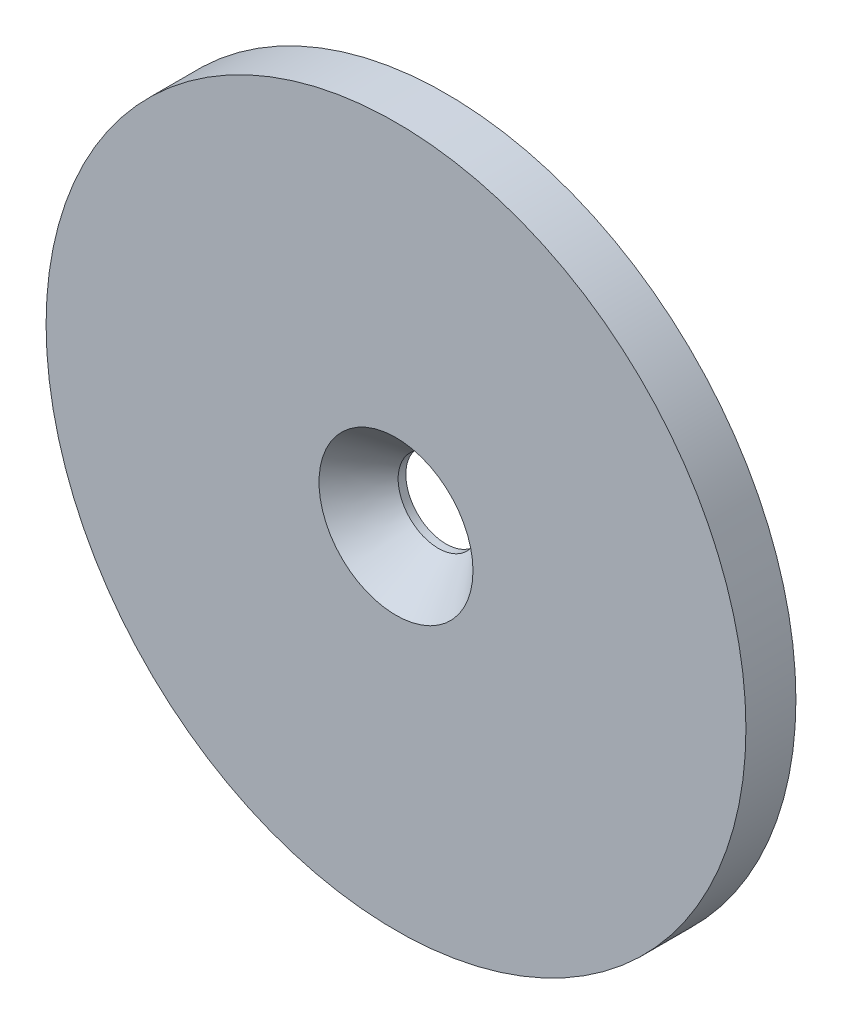
ISO-10303-21;
HEADER;
FILE_DESCRIPTION(('STEP AP214'),'2;1');
FILE_NAME('part.step','',(''),(''),'','','');
FILE_SCHEMA(('AUTOMOTIVE_DESIGN { 1 0 10303 214 1 1 1 1 }'));
ENDSEC;
DATA;
#1=APPLICATION_CONTEXT('core data for automotive mechanical design processes');
#2=APPLICATION_PROTOCOL_DEFINITION('international standard','automotive_design',2000,#1);
#3=PRODUCT_CONTEXT('',#1,'mechanical');
#4=PRODUCT('Part','Part','',(#3));
#5=PRODUCT_RELATED_PRODUCT_CATEGORY('part','',(#4));
#6=PRODUCT_DEFINITION_FORMATION('','',#4);
#7=PRODUCT_DEFINITION_CONTEXT('part definition',#1,'design');
#8=PRODUCT_DEFINITION('design','',#6,#7);
#9=PRODUCT_DEFINITION_SHAPE('','',#8);
#10=(LENGTH_UNIT() NAMED_UNIT(*) SI_UNIT(.MILLI.,.METRE.));
#11=(NAMED_UNIT(*) PLANE_ANGLE_UNIT() SI_UNIT($,.RADIAN.));
#12=(NAMED_UNIT(*) SI_UNIT($,.STERADIAN.) SOLID_ANGLE_UNIT());
#13=UNCERTAINTY_MEASURE_WITH_UNIT(LENGTH_MEASURE(1.E-05),#10,'distance_accuracy_value','');
#14=(GEOMETRIC_REPRESENTATION_CONTEXT(3) GLOBAL_UNCERTAINTY_ASSIGNED_CONTEXT((#13)) GLOBAL_UNIT_ASSIGNED_CONTEXT((#10,
#11,#12)) REPRESENTATION_CONTEXT('',''));
#15=CARTESIAN_POINT('',(0.,0.,0.));
#16=DIRECTION('',(0.,0.,1.));
#17=DIRECTION('',(1.,0.,0.));
#18=AXIS2_PLACEMENT_3D('',#15,#16,#17);
#19=CARTESIAN_POINT('',(0.,0.,3.175));
#20=DIRECTION('',(0.,0.,1.));
#21=DIRECTION('',(1.,0.,0.));
#22=AXIS2_PLACEMENT_3D('',#19,#20,#21);
#23=PLANE('',#22);
#24=CARTESIAN_POINT('',(0.,0.,3.175));
#25=DIRECTION('',(0.,0.,1.));
#26=DIRECTION('',(1.,0.,0.));
#27=AXIS2_PLACEMENT_3D('',#24,#25,#26);
#28=CIRCLE('',#27,4.8895);
#29=CARTESIAN_POINT('',(4.8895,0.,3.175));
#30=VERTEX_POINT('',#29);
#31=EDGE_CURVE('E61',#30,#30,#28,.T.);
#32=ORIENTED_EDGE('',*,*,#31,.F.);
#33=EDGE_LOOP('',(#32));
#34=FACE_BOUND('',#33,.T.);
#35=CARTESIAN_POINT('',(0.,0.,3.175));
#36=DIRECTION('',(0.,0.,1.));
#37=DIRECTION('',(1.,0.,0.));
#38=AXIS2_PLACEMENT_3D('',#35,#36,#37);
#39=CIRCLE('',#38,22.225);
#40=CARTESIAN_POINT('',(22.225,0.,3.175));
#41=VERTEX_POINT('',#40);
#42=EDGE_CURVE('E10',#41,#41,#39,.T.);
#43=ORIENTED_EDGE('',*,*,#42,.T.);
#44=EDGE_LOOP('',(#43));
#45=FACE_BOUND('',#44,.T.);
#46=ADVANCED_FACE('F43',(#34,#45),#23,.T.);
#47=CARTESIAN_POINT('',(0.,0.,0.));
#48=DIRECTION('',(0.,0.,1.));
#49=DIRECTION('',(1.,0.,0.));
#50=AXIS2_PLACEMENT_3D('',#47,#48,#49);
#51=PLANE('',#50);
#52=CARTESIAN_POINT('',(0.,0.,0.));
#53=DIRECTION('',(0.,0.,1.));
#54=DIRECTION('',(1.,0.,0.));
#55=AXIS2_PLACEMENT_3D('',#52,#53,#54);
#56=CIRCLE('',#55,2.5527);
#57=CARTESIAN_POINT('',(2.5527,0.,0.));
#58=VERTEX_POINT('',#57);
#59=EDGE_CURVE('E54',#58,#58,#56,.T.);
#60=ORIENTED_EDGE('',*,*,#59,.T.);
#61=EDGE_LOOP('',(#60));
#62=FACE_BOUND('',#61,.T.);
#63=CARTESIAN_POINT('',(0.,0.,0.));
#64=DIRECTION('',(0.,0.,1.));
#65=DIRECTION('',(1.,0.,0.));
#66=AXIS2_PLACEMENT_3D('',#63,#64,#65);
#67=CIRCLE('',#66,22.225);
#68=CARTESIAN_POINT('',(22.225,0.,0.));
#69=VERTEX_POINT('',#68);
#70=EDGE_CURVE('E47',#69,#69,#67,.T.);
#71=ORIENTED_EDGE('',*,*,#70,.F.);
#72=EDGE_LOOP('',(#71));
#73=FACE_BOUND('',#72,.T.);
#74=ADVANCED_FACE('F68',(#62,#73),#51,.F.);
#75=CARTESIAN_POINT('',(0.,0.,3.175));
#76=DIRECTION('',(0.,0.,-1.));
#77=DIRECTION('',(-1.,0.,0.));
#78=AXIS2_PLACEMENT_3D('',#75,#76,#77);
#79=CYLINDRICAL_SURFACE('',#78,22.225);
#80=ORIENTED_EDGE('',*,*,#42,.F.);
#81=EDGE_LOOP('',(#80));
#82=FACE_BOUND('',#81,.T.);
#83=ORIENTED_EDGE('',*,*,#70,.T.);
#84=EDGE_LOOP('',(#83));
#85=FACE_BOUND('',#84,.T.);
#86=ADVANCED_FACE('F45',(#82,#85),#79,.T.);
#87=CARTESIAN_POINT('',(0.,0.,3.175));
#88=DIRECTION('',(0.,0.,1.));
#89=DIRECTION('',(1.,0.,0.));
#90=AXIS2_PLACEMENT_3D('',#87,#88,#89);
#91=CYLINDRICAL_SURFACE('',#90,2.5527);
#92=ORIENTED_EDGE('',*,*,#59,.F.);
#93=EDGE_LOOP('',(#92));
#94=FACE_BOUND('',#93,.T.);
#95=CARTESIAN_POINT('',(0.,0.,0.486819106005947));
#96=DIRECTION('',(0.,0.,1.));
#97=DIRECTION('',(1.,0.,0.));
#98=AXIS2_PLACEMENT_3D('',#95,#96,#97);
#99=CIRCLE('',#98,2.5527);
#100=CARTESIAN_POINT('',(2.5527,0.,0.486819106005947));
#101=VERTEX_POINT('',#100);
#102=EDGE_CURVE('E58',#101,#101,#99,.T.);
#103=ORIENTED_EDGE('',*,*,#102,.T.);
#104=EDGE_LOOP('',(#103));
#105=FACE_BOUND('',#104,.T.);
#106=ADVANCED_FACE('F76',(#94,#105),#91,.F.);
#107=CARTESIAN_POINT('',(0.,0.,3.175));
#108=DIRECTION('',(0.,0.,1.));
#109=DIRECTION('',(1.,0.,0.));
#110=AXIS2_PLACEMENT_3D('',#107,#108,#109);
#111=CONICAL_SURFACE('',#110,4.8895,0.715584993317675);
#112=ORIENTED_EDGE('',*,*,#102,.F.);
#113=EDGE_LOOP('',(#112));
#114=FACE_BOUND('',#113,.T.);
#115=ORIENTED_EDGE('',*,*,#31,.T.);
#116=EDGE_LOOP('',(#115));
#117=FACE_BOUND('',#116,.T.);
#118=ADVANCED_FACE('F65',(#114,#117),#111,.F.);
#119=CLOSED_SHELL('',(#46,#74,#86,#106,#118));
#120=MANIFOLD_SOLID_BREP('B2',#119);
#121=ADVANCED_BREP_SHAPE_REPRESENTATION('',(#18,#120),#14);
#122=SHAPE_DEFINITION_REPRESENTATION(#9,#121);
ENDSEC;
END-ISO-10303-21;
